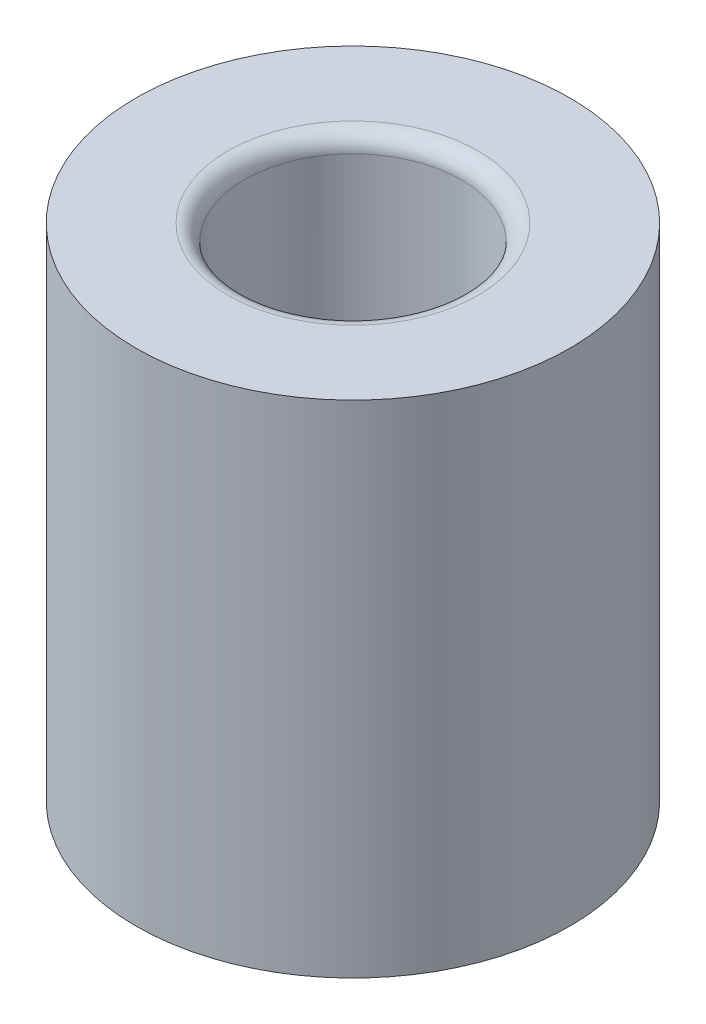
ISO-10303-21;
HEADER;
FILE_DESCRIPTION(('STEP AP214'),'2;1');
FILE_NAME('part.step','',(''),(''),'','','');
FILE_SCHEMA(('AUTOMOTIVE_DESIGN { 1 0 10303 214 1 1 1 1 }'));
ENDSEC;
DATA;
#1=APPLICATION_CONTEXT('core data for automotive mechanical design processes');
#2=APPLICATION_PROTOCOL_DEFINITION('international standard','automotive_design',2000,#1);
#3=PRODUCT_CONTEXT('',#1,'mechanical');
#4=PRODUCT('Part','Part','',(#3));
#5=PRODUCT_RELATED_PRODUCT_CATEGORY('part','',(#4));
#6=PRODUCT_DEFINITION_FORMATION('','',#4);
#7=PRODUCT_DEFINITION_CONTEXT('part definition',#1,'design');
#8=PRODUCT_DEFINITION('design','',#6,#7);
#9=PRODUCT_DEFINITION_SHAPE('','',#8);
#10=(LENGTH_UNIT() NAMED_UNIT(*) SI_UNIT(.MILLI.,.METRE.));
#11=(NAMED_UNIT(*) PLANE_ANGLE_UNIT() SI_UNIT($,.RADIAN.));
#12=(NAMED_UNIT(*) SI_UNIT($,.STERADIAN.) SOLID_ANGLE_UNIT());
#13=UNCERTAINTY_MEASURE_WITH_UNIT(LENGTH_MEASURE(1.E-05),#10,'distance_accuracy_value','');
#14=(GEOMETRIC_REPRESENTATION_CONTEXT(3) GLOBAL_UNCERTAINTY_ASSIGNED_CONTEXT((#13)) GLOBAL_UNIT_ASSIGNED_CONTEXT((#10,
#11,#12)) REPRESENTATION_CONTEXT('',''));
#15=CARTESIAN_POINT('',(0.,0.,0.));
#16=DIRECTION('',(0.,0.,1.));
#17=DIRECTION('',(1.,0.,0.));
#18=AXIS2_PLACEMENT_3D('',#15,#16,#17);
#19=CARTESIAN_POINT('',(0.,15.,0.));
#20=DIRECTION('',(0.,-1.,0.));
#21=DIRECTION('',(0.,0.,-1.));
#22=AXIS2_PLACEMENT_3D('',#19,#20,#21);
#23=CYLINDRICAL_SURFACE('',#22,6.5);
#24=CARTESIAN_POINT('',(0.,15.,0.));
#25=DIRECTION('',(0.,1.,0.));
#26=DIRECTION('',(0.,0.,1.));
#27=AXIS2_PLACEMENT_3D('',#24,#25,#26);
#28=CIRCLE('',#27,6.5);
#29=CARTESIAN_POINT('',(0.,15.,6.5));
#30=VERTEX_POINT('',#29);
#31=EDGE_CURVE('E60',#30,#30,#28,.T.);
#32=ORIENTED_EDGE('',*,*,#31,.F.);
#33=EDGE_LOOP('',(#32));
#34=FACE_BOUND('',#33,.T.);
#35=CARTESIAN_POINT('',(0.,0.,0.));
#36=DIRECTION('',(0.,1.,0.));
#37=DIRECTION('',(0.,0.,1.));
#38=AXIS2_PLACEMENT_3D('',#35,#36,#37);
#39=CIRCLE('',#38,6.5);
#40=CARTESIAN_POINT('',(0.,0.,6.5));
#41=VERTEX_POINT('',#40);
#42=EDGE_CURVE('E61',#41,#41,#39,.T.);
#43=ORIENTED_EDGE('',*,*,#42,.T.);
#44=EDGE_LOOP('',(#43));
#45=FACE_BOUND('',#44,.T.);
#46=ADVANCED_FACE('F34',(#34,#45),#23,.T.);
#47=CARTESIAN_POINT('',(0.,15.,0.));
#48=DIRECTION('',(0.,1.,0.));
#49=DIRECTION('',(0.,0.,1.));
#50=AXIS2_PLACEMENT_3D('',#47,#48,#49);
#51=PLANE('',#50);
#52=CARTESIAN_POINT('',(0.,15.,0.));
#53=DIRECTION('',(0.,1.,0.));
#54=DIRECTION('',(0.,0.,1.));
#55=AXIS2_PLACEMENT_3D('',#52,#53,#54);
#56=CIRCLE('',#55,3.75);
#57=CARTESIAN_POINT('',(0.,15.,3.75));
#58=VERTEX_POINT('',#57);
#59=EDGE_CURVE('E41',#58,#58,#56,.F.);
#60=ORIENTED_EDGE('',*,*,#59,.T.);
#61=EDGE_LOOP('',(#60));
#62=FACE_BOUND('',#61,.T.);
#63=ORIENTED_EDGE('',*,*,#31,.T.);
#64=EDGE_LOOP('',(#63));
#65=FACE_BOUND('',#64,.T.);
#66=ADVANCED_FACE('F84',(#62,#65),#51,.T.);
#67=CARTESIAN_POINT('',(0.,0.,0.));
#68=DIRECTION('',(0.,1.,0.));
#69=DIRECTION('',(0.,0.,1.));
#70=AXIS2_PLACEMENT_3D('',#67,#68,#69);
#71=PLANE('',#70);
#72=CARTESIAN_POINT('',(0.,0.,0.));
#73=DIRECTION('',(0.,1.,0.));
#74=DIRECTION('',(0.,0.,1.));
#75=AXIS2_PLACEMENT_3D('',#72,#73,#74);
#76=CIRCLE('',#75,5.00000000000001);
#77=CARTESIAN_POINT('',(0.,0.,5.00000000000001));
#78=VERTEX_POINT('',#77);
#79=EDGE_CURVE('E54',#78,#78,#76,.T.);
#80=ORIENTED_EDGE('',*,*,#79,.T.);
#81=EDGE_LOOP('',(#80));
#82=FACE_BOUND('',#81,.T.);
#83=ORIENTED_EDGE('',*,*,#42,.F.);
#84=EDGE_LOOP('',(#83));
#85=FACE_BOUND('',#84,.T.);
#86=ADVANCED_FACE('F74',(#82,#85),#71,.F.);
#87=CARTESIAN_POINT('',(0.,3.1,0.));
#88=DIRECTION('',(0.,-1.,0.));
#89=DIRECTION('',(0.,0.,-1.));
#90=AXIS2_PLACEMENT_3D('',#87,#88,#89);
#91=CYLINDRICAL_SURFACE('',#90,4.5);
#92=CARTESIAN_POINT('',(0.,0.500000000000009,0.));
#93=DIRECTION('',(0.,1.,0.));
#94=DIRECTION('',(0.,0.,1.));
#95=AXIS2_PLACEMENT_3D('',#92,#93,#94);
#96=CIRCLE('',#95,4.5);
#97=CARTESIAN_POINT('',(0.,0.500000000000009,-4.5));
#98=VERTEX_POINT('',#97);
#99=EDGE_CURVE('E57',#98,#98,#96,.F.);
#100=CARTESIAN_POINT('',(0.,3.1,0.));
#101=DIRECTION('',(0.,-1.,0.));
#102=DIRECTION('',(0.,0.,-1.));
#103=AXIS2_PLACEMENT_3D('',#100,#101,#102);
#104=CIRCLE('',#103,4.5);
#105=CARTESIAN_POINT('',(0.,3.1,-4.5));
#106=VERTEX_POINT('',#105);
#107=EDGE_CURVE('E64',#106,#106,#104,.T.);
#108=CARTESIAN_POINT('',(0.,0.500000000000009,-4.5));
#109=CARTESIAN_POINT('',(0.,0.527083333333342,-4.5));
#110=CARTESIAN_POINT('',(0.,0.554166666666676,-4.5));
#111=CARTESIAN_POINT('',(0.,0.608333333333342,-4.5));
#112=CARTESIAN_POINT('',(0.,0.635416666666675,-4.5));
#113=CARTESIAN_POINT('',(0.,0.689583333333342,-4.5));
#114=CARTESIAN_POINT('',(0.,0.716666666666675,-4.5));
#115=CARTESIAN_POINT('',(0.,0.770833333333342,-4.5));
#116=CARTESIAN_POINT('',(0.,0.797916666666675,-4.5));
#117=CARTESIAN_POINT('',(0.,0.852083333333341,-4.5));
#118=CARTESIAN_POINT('',(0.,0.879166666666674,-4.5));
#119=CARTESIAN_POINT('',(0.,0.933333333333341,-4.5));
#120=CARTESIAN_POINT('',(0.,0.960416666666674,-4.5));
#121=CARTESIAN_POINT('',(0.,1.01458333333334,-4.5));
#122=CARTESIAN_POINT('',(0.,1.04166666666667,-4.5));
#123=CARTESIAN_POINT('',(0.,1.09583333333334,-4.5));
#124=CARTESIAN_POINT('',(0.,1.12291666666667,-4.5));
#125=CARTESIAN_POINT('',(0.,1.17708333333334,-4.5));
#126=CARTESIAN_POINT('',(0.,1.20416666666667,-4.5));
#127=CARTESIAN_POINT('',(0.,1.25833333333334,-4.5));
#128=CARTESIAN_POINT('',(0.,1.28541666666667,-4.5));
#129=CARTESIAN_POINT('',(0.,1.33958333333334,-4.5));
#130=CARTESIAN_POINT('',(0.,1.36666666666667,-4.5));
#131=CARTESIAN_POINT('',(0.,1.42083333333334,-4.5));
#132=CARTESIAN_POINT('',(0.,1.44791666666667,-4.5));
#133=CARTESIAN_POINT('',(0.,1.50208333333334,-4.5));
#134=CARTESIAN_POINT('',(0.,1.52916666666667,-4.5));
#135=CARTESIAN_POINT('',(0.,1.58333333333334,-4.5));
#136=CARTESIAN_POINT('',(0.,1.61041666666667,-4.5));
#137=CARTESIAN_POINT('',(0.,1.66458333333334,-4.5));
#138=CARTESIAN_POINT('',(0.,1.69166666666667,-4.5));
#139=CARTESIAN_POINT('',(0.,1.74583333333334,-4.5));
#140=CARTESIAN_POINT('',(0.,1.77291666666667,-4.5));
#141=CARTESIAN_POINT('',(0.,1.82708333333334,-4.5));
#142=CARTESIAN_POINT('',(0.,1.85416666666667,-4.5));
#143=CARTESIAN_POINT('',(0.,1.90833333333334,-4.5));
#144=CARTESIAN_POINT('',(0.,1.93541666666667,-4.5));
#145=CARTESIAN_POINT('',(0.,1.98958333333334,-4.5));
#146=CARTESIAN_POINT('',(0.,2.01666666666667,-4.5));
#147=CARTESIAN_POINT('',(0.,2.07083333333334,-4.5));
#148=CARTESIAN_POINT('',(0.,2.09791666666667,-4.5));
#149=CARTESIAN_POINT('',(0.,2.15208333333334,-4.5));
#150=CARTESIAN_POINT('',(0.,2.17916666666667,-4.5));
#151=CARTESIAN_POINT('',(0.,2.23333333333334,-4.5));
#152=CARTESIAN_POINT('',(0.,2.26041666666667,-4.5));
#153=CARTESIAN_POINT('',(0.,2.31458333333334,-4.5));
#154=CARTESIAN_POINT('',(0.,2.34166666666667,-4.5));
#155=CARTESIAN_POINT('',(0.,2.39583333333334,-4.5));
#156=CARTESIAN_POINT('',(0.,2.42291666666667,-4.5));
#157=CARTESIAN_POINT('',(0.,2.47708333333334,-4.5));
#158=CARTESIAN_POINT('',(0.,2.50416666666667,-4.5));
#159=CARTESIAN_POINT('',(0.,2.55833333333334,-4.5));
#160=CARTESIAN_POINT('',(0.,2.58541666666667,-4.5));
#161=CARTESIAN_POINT('',(0.,2.63958333333333,-4.5));
#162=CARTESIAN_POINT('',(0.,2.66666666666667,-4.5));
#163=CARTESIAN_POINT('',(0.,2.72083333333333,-4.5));
#164=CARTESIAN_POINT('',(0.,2.74791666666667,-4.5));
#165=CARTESIAN_POINT('',(0.,2.80208333333333,-4.5));
#166=CARTESIAN_POINT('',(0.,2.82916666666667,-4.5));
#167=CARTESIAN_POINT('',(0.,2.88333333333333,-4.5));
#168=CARTESIAN_POINT('',(0.,2.91041666666667,-4.5));
#169=CARTESIAN_POINT('',(0.,2.96458333333333,-4.5));
#170=CARTESIAN_POINT('',(0.,2.99166666666667,-4.5));
#171=CARTESIAN_POINT('',(0.,3.04583333333333,-4.5));
#172=CARTESIAN_POINT('',(0.,3.07291666666667,-4.5));
#173=CARTESIAN_POINT('',(0.,3.1,-4.5));
#174=B_SPLINE_CURVE_WITH_KNOTS('',3,(#108,#109,#110,#111,#112,#113,#114,#115,#116,#117,#118,
#119,#120,#121,#122,#123,#124,#125,#126,#127,#128,#129,#130,#131,#132,#133,#134,#135,#136,#137,
#138,#139,#140,#141,#142,#143,#144,#145,#146,#147,#148,#149,#150,#151,#152,#153,#154,#155,#156,
#157,#158,#159,#160,#161,#162,#163,#164,#165,#166,#167,#168,#169,#170,#171,#172,#173),
.UNSPECIFIED.,.F.,.F.,(4,2,2,2,2,2,2,2,2,2,2,2,2,2,2,2,2,2,2,2,2,2,2,2,2,2,2,2,2,2,2,2,4),(0.,
0.0812499999999997,0.162499999999999,0.243749999999999,0.324999999999999,0.406249999999999,
0.487499999999998,0.568749999999998,0.649999999999998,0.731249999999997,0.812499999999997,
0.893749999999997,0.974999999999997,1.05625,1.1375,1.21875,1.3,1.38125,1.4625,1.54374999999999,
1.62499999999999,1.70624999999999,1.78749999999999,1.86874999999999,1.94999999999999,
2.03124999999999,2.11249999999999,2.19374999999999,2.27499999999999,2.35624999999999,
2.43749999999999,2.51874999999999,2.59999999999999),.UNSPECIFIED.);
#175=EDGE_CURVE('BSEAM72',#98,#106,#174,.T.);
#176=ORIENTED_EDGE('',*,*,#99,.T.);
#177=ORIENTED_EDGE('',*,*,#107,.F.);
#178=ORIENTED_EDGE('',*,*,#175,.T.);
#179=ORIENTED_EDGE('',*,*,#175,.F.);
#180=EDGE_LOOP('',(#176,#178,#177,#179));
#181=FACE_BOUND('',#180,.T.);
#182=ADVANCED_FACE('F72',(#181),#91,.F.);
#183=CARTESIAN_POINT('',(0.,3.1,0.));
#184=DIRECTION('',(0.,-1.,0.));
#185=DIRECTION('',(0.,0.,-1.));
#186=AXIS2_PLACEMENT_3D('',#183,#184,#185);
#187=PLANE('',#186);
#188=CARTESIAN_POINT('',(0.,3.1,0.));
#189=DIRECTION('',(0.,-1.,0.));
#190=DIRECTION('',(0.,0.,-1.));
#191=AXIS2_PLACEMENT_3D('',#188,#189,#190);
#192=CIRCLE('',#191,3.75);
#193=CARTESIAN_POINT('',(0.,3.1,-3.75));
#194=VERTEX_POINT('',#193);
#195=EDGE_CURVE('E45',#194,#194,#192,.F.);
#196=ORIENTED_EDGE('',*,*,#195,.T.);
#197=EDGE_LOOP('',(#196));
#198=FACE_BOUND('',#197,.T.);
#199=ORIENTED_EDGE('',*,*,#107,.T.);
#200=EDGE_LOOP('',(#199));
#201=FACE_BOUND('',#200,.T.);
#202=ADVANCED_FACE('F70',(#198,#201),#187,.T.);
#203=CARTESIAN_POINT('',(0.,15.,0.));
#204=DIRECTION('',(0.,-1.,0.));
#205=DIRECTION('',(0.,0.,-1.));
#206=AXIS2_PLACEMENT_3D('',#203,#204,#205);
#207=CYLINDRICAL_SURFACE('',#206,3.25);
#208=CARTESIAN_POINT('',(0.,14.5,0.));
#209=DIRECTION('',(0.,1.,0.));
#210=DIRECTION('',(0.,0.,1.));
#211=AXIS2_PLACEMENT_3D('',#208,#209,#210);
#212=CIRCLE('',#211,3.25);
#213=CARTESIAN_POINT('',(0.,14.5,-3.25));
#214=VERTEX_POINT('',#213);
#215=EDGE_CURVE('E10',#214,#214,#212,.T.);
#216=CARTESIAN_POINT('',(0.,3.6,0.));
#217=DIRECTION('',(0.,-1.,0.));
#218=DIRECTION('',(0.,0.,-1.));
#219=AXIS2_PLACEMENT_3D('',#216,#217,#218);
#220=CIRCLE('',#219,3.25);
#221=CARTESIAN_POINT('',(0.,3.6,-3.25));
#222=VERTEX_POINT('',#221);
#223=EDGE_CURVE('E49',#222,#222,#220,.T.);
#224=CARTESIAN_POINT('',(0.,14.5,-3.25));
#225=CARTESIAN_POINT('',(0.,14.3864583333333,-3.25));
#226=CARTESIAN_POINT('',(0.,14.2729166666667,-3.25));
#227=CARTESIAN_POINT('',(0.,14.0458333333333,-3.25));
#228=CARTESIAN_POINT('',(0.,13.9322916666667,-3.25));
#229=CARTESIAN_POINT('',(0.,13.7052083333333,-3.25));
#230=CARTESIAN_POINT('',(0.,13.5916666666667,-3.25));
#231=CARTESIAN_POINT('',(0.,13.3645833333333,-3.25));
#232=CARTESIAN_POINT('',(0.,13.2510416666667,-3.25));
#233=CARTESIAN_POINT('',(0.,13.0239583333333,-3.25));
#234=CARTESIAN_POINT('',(0.,12.9104166666667,-3.25));
#235=CARTESIAN_POINT('',(0.,12.6833333333333,-3.25));
#236=CARTESIAN_POINT('',(0.,12.5697916666667,-3.25));
#237=CARTESIAN_POINT('',(0.,12.3427083333333,-3.25));
#238=CARTESIAN_POINT('',(0.,12.2291666666667,-3.25));
#239=CARTESIAN_POINT('',(0.,12.0020833333333,-3.25));
#240=CARTESIAN_POINT('',(0.,11.8885416666667,-3.25));
#241=CARTESIAN_POINT('',(0.,11.6614583333333,-3.25));
#242=CARTESIAN_POINT('',(0.,11.5479166666667,-3.25));
#243=CARTESIAN_POINT('',(0.,11.3208333333333,-3.25));
#244=CARTESIAN_POINT('',(0.,11.2072916666667,-3.25));
#245=CARTESIAN_POINT('',(0.,10.9802083333333,-3.25));
#246=CARTESIAN_POINT('',(0.,10.8666666666667,-3.25));
#247=CARTESIAN_POINT('',(0.,10.6395833333333,-3.25));
#248=CARTESIAN_POINT('',(0.,10.5260416666667,-3.25));
#249=CARTESIAN_POINT('',(0.,10.2989583333333,-3.25));
#250=CARTESIAN_POINT('',(0.,10.1854166666667,-3.25));
#251=CARTESIAN_POINT('',(0.,9.95833333333333,-3.25));
#252=CARTESIAN_POINT('',(0.,9.84479166666667,-3.25));
#253=CARTESIAN_POINT('',(0.,9.61770833333333,-3.25));
#254=CARTESIAN_POINT('',(0.,9.50416666666667,-3.25));
#255=CARTESIAN_POINT('',(0.,9.27708333333333,-3.25));
#256=CARTESIAN_POINT('',(0.,9.16354166666667,-3.25));
#257=CARTESIAN_POINT('',(0.,8.93645833333333,-3.25));
#258=CARTESIAN_POINT('',(0.,8.82291666666667,-3.25));
#259=CARTESIAN_POINT('',(0.,8.59583333333333,-3.25));
#260=CARTESIAN_POINT('',(0.,8.48229166666667,-3.25));
#261=CARTESIAN_POINT('',(0.,8.25520833333334,-3.25));
#262=CARTESIAN_POINT('',(0.,8.14166666666667,-3.25));
#263=CARTESIAN_POINT('',(0.,7.91458333333333,-3.25));
#264=CARTESIAN_POINT('',(0.,7.80104166666667,-3.25));
#265=CARTESIAN_POINT('',(0.,7.57395833333333,-3.25));
#266=CARTESIAN_POINT('',(0.,7.46041666666667,-3.25));
#267=CARTESIAN_POINT('',(0.,7.23333333333333,-3.25));
#268=CARTESIAN_POINT('',(0.,7.11979166666667,-3.25));
#269=CARTESIAN_POINT('',(0.,6.89270833333333,-3.25));
#270=CARTESIAN_POINT('',(0.,6.77916666666667,-3.25));
#271=CARTESIAN_POINT('',(0.,6.55208333333333,-3.25));
#272=CARTESIAN_POINT('',(0.,6.43854166666667,-3.25));
#273=CARTESIAN_POINT('',(0.,6.21145833333333,-3.25));
#274=CARTESIAN_POINT('',(0.,6.09791666666667,-3.25));
#275=CARTESIAN_POINT('',(0.,5.87083333333333,-3.25));
#276=CARTESIAN_POINT('',(0.,5.75729166666667,-3.25));
#277=CARTESIAN_POINT('',(0.,5.53020833333333,-3.25));
#278=CARTESIAN_POINT('',(0.,5.41666666666667,-3.25));
#279=CARTESIAN_POINT('',(0.,5.18958333333333,-3.25));
#280=CARTESIAN_POINT('',(0.,5.07604166666667,-3.25));
#281=CARTESIAN_POINT('',(0.,4.84895833333333,-3.25));
#282=CARTESIAN_POINT('',(0.,4.73541666666667,-3.25));
#283=CARTESIAN_POINT('',(0.,4.50833333333333,-3.25));
#284=CARTESIAN_POINT('',(0.,4.39479166666667,-3.25));
#285=CARTESIAN_POINT('',(0.,4.16770833333333,-3.25));
#286=CARTESIAN_POINT('',(0.,4.05416666666667,-3.25));
#287=CARTESIAN_POINT('',(0.,3.82708333333333,-3.25));
#288=CARTESIAN_POINT('',(0.,3.71354166666667,-3.25));
#289=CARTESIAN_POINT('',(0.,3.6,-3.25));
#290=B_SPLINE_CURVE_WITH_KNOTS('',3,(#224,#225,#226,#227,#228,#229,#230,#231,#232,#233,#234,
#235,#236,#237,#238,#239,#240,#241,#242,#243,#244,#245,#246,#247,#248,#249,#250,#251,#252,#253,
#254,#255,#256,#257,#258,#259,#260,#261,#262,#263,#264,#265,#266,#267,#268,#269,#270,#271,#272,
#273,#274,#275,#276,#277,#278,#279,#280,#281,#282,#283,#284,#285,#286,#287,#288,#289),
.UNSPECIFIED.,.F.,.F.,(4,2,2,2,2,2,2,2,2,2,2,2,2,2,2,2,2,2,2,2,2,2,2,2,2,2,2,2,2,2,2,2,4),(0.,
0.340624999999999,0.68125,1.021875,1.3625,1.703125,2.04375,2.384375,2.725,3.065625,3.40625,
3.746875,4.0875,4.428125,4.76875,5.109375,5.45,5.790625,6.13125,6.471875,6.8125,7.153125,
7.49375,7.834375,8.175,8.515625,8.85625,9.196875,9.5375,9.878125,10.21875,10.559375,10.9),.UNSPECIFIED.);
#291=EDGE_CURVE('BSEAM81',#214,#222,#290,.T.);
#292=ORIENTED_EDGE('',*,*,#215,.T.);
#293=ORIENTED_EDGE('',*,*,#223,.T.);
#294=ORIENTED_EDGE('',*,*,#291,.T.);
#295=ORIENTED_EDGE('',*,*,#291,.F.);
#296=EDGE_LOOP('',(#292,#294,#293,#295));
#297=FACE_BOUND('',#296,.T.);
#298=ADVANCED_FACE('F81',(#297),#207,.F.);
#299=CARTESIAN_POINT('',(0.,0.500000000000009,0.));
#300=DIRECTION('',(0.,-1.,0.));
#301=DIRECTION('',(0.,0.,-1.));
#302=AXIS2_PLACEMENT_3D('',#299,#300,#301);
#303=CONICAL_SURFACE('',#302,4.5,0.785398163397447);
#304=ORIENTED_EDGE('',*,*,#79,.F.);
#305=EDGE_LOOP('',(#304));
#306=FACE_BOUND('',#305,.T.);
#307=ORIENTED_EDGE('',*,*,#99,.F.);
#308=EDGE_LOOP('',(#307));
#309=FACE_BOUND('',#308,.T.);
#310=ADVANCED_FACE('F97',(#306,#309),#303,.F.);
#311=CARTESIAN_POINT('',(0.,3.6,0.));
#312=DIRECTION('',(0.,-1.,0.));
#313=DIRECTION('',(0.,0.,-1.));
#314=AXIS2_PLACEMENT_3D('',#311,#312,#313);
#315=TOROIDAL_SURFACE('',#314,3.75,0.5);
#316=ORIENTED_EDGE('',*,*,#195,.F.);
#317=EDGE_LOOP('',(#316));
#318=FACE_BOUND('',#317,.T.);
#319=ORIENTED_EDGE('',*,*,#223,.F.);
#320=EDGE_LOOP('',(#319));
#321=FACE_BOUND('',#320,.T.);
#322=ADVANCED_FACE('F99',(#318,#321),#315,.T.);
#323=CARTESIAN_POINT('',(0.,14.5,0.));
#324=DIRECTION('',(0.,1.,0.));
#325=DIRECTION('',(0.,0.,1.));
#326=AXIS2_PLACEMENT_3D('',#323,#324,#325);
#327=TOROIDAL_SURFACE('',#326,3.75,0.5);
#328=ORIENTED_EDGE('',*,*,#215,.F.);
#329=EDGE_LOOP('',(#328));
#330=FACE_BOUND('',#329,.T.);
#331=ORIENTED_EDGE('',*,*,#59,.F.);
#332=EDGE_LOOP('',(#331));
#333=FACE_BOUND('',#332,.T.);
#334=ADVANCED_FACE('F36',(#330,#333),#327,.T.);
#335=CLOSED_SHELL('',(#46,#66,#86,#182,#202,#298,#310,#322,#334));
#336=MANIFOLD_SOLID_BREP('B2',#335);
#337=ADVANCED_BREP_SHAPE_REPRESENTATION('',(#18,#336),#14);
#338=SHAPE_DEFINITION_REPRESENTATION(#9,#337);
ENDSEC;
END-ISO-10303-21;
